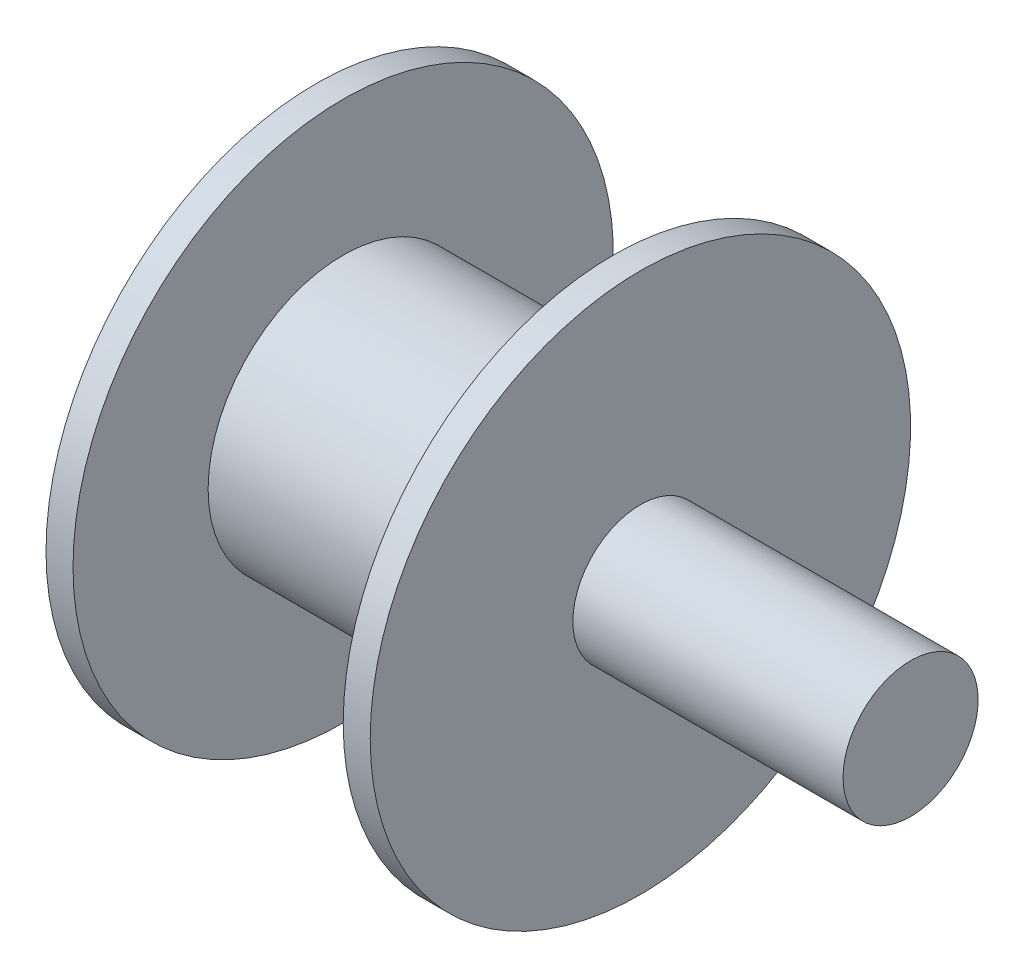
ISO-10303-21;
HEADER;
FILE_DESCRIPTION(('STEP AP214'),'2;1');
FILE_NAME('part.step','',(''),(''),'','','');
FILE_SCHEMA(('AUTOMOTIVE_DESIGN { 1 0 10303 214 1 1 1 1 }'));
ENDSEC;
DATA;
#1=APPLICATION_CONTEXT('core data for automotive mechanical design processes');
#2=APPLICATION_PROTOCOL_DEFINITION('international standard','automotive_design',2000,#1);
#3=PRODUCT_CONTEXT('',#1,'mechanical');
#4=PRODUCT('Part','Part','',(#3));
#5=PRODUCT_RELATED_PRODUCT_CATEGORY('part','',(#4));
#6=PRODUCT_DEFINITION_FORMATION('','',#4);
#7=PRODUCT_DEFINITION_CONTEXT('part definition',#1,'design');
#8=PRODUCT_DEFINITION('design','',#6,#7);
#9=PRODUCT_DEFINITION_SHAPE('','',#8);
#10=(LENGTH_UNIT() NAMED_UNIT(*) SI_UNIT(.MILLI.,.METRE.));
#11=(NAMED_UNIT(*) PLANE_ANGLE_UNIT() SI_UNIT($,.RADIAN.));
#12=(NAMED_UNIT(*) SI_UNIT($,.STERADIAN.) SOLID_ANGLE_UNIT());
#13=UNCERTAINTY_MEASURE_WITH_UNIT(LENGTH_MEASURE(1.E-05),#10,'distance_accuracy_value','');
#14=(GEOMETRIC_REPRESENTATION_CONTEXT(3) GLOBAL_UNCERTAINTY_ASSIGNED_CONTEXT((#13)) GLOBAL_UNIT_ASSIGNED_CONTEXT((#10,
#11,#12)) REPRESENTATION_CONTEXT('',''));
#15=CARTESIAN_POINT('',(0.,0.,0.));
#16=DIRECTION('',(0.,0.,1.));
#17=DIRECTION('',(1.,0.,0.));
#18=AXIS2_PLACEMENT_3D('',#15,#16,#17);
#19=CARTESIAN_POINT('',(-50.948509485101,0.,0.));
#20=DIRECTION('',(1.,0.,0.));
#21=DIRECTION('',(0.,0.,-1.));
#22=AXIS2_PLACEMENT_3D('',#19,#20,#21);
#23=PLANE('',#22);
#24=CARTESIAN_POINT('',(-50.948509485101,0.,0.));
#25=DIRECTION('',(-1.,0.,0.));
#26=DIRECTION('',(0.,0.,1.));
#27=AXIS2_PLACEMENT_3D('',#24,#25,#26);
#28=CIRCLE('',#27,20.);
#29=CARTESIAN_POINT('',(-50.948509485101,0.,20.));
#30=VERTEX_POINT('',#29);
#31=EDGE_CURVE('E10',#30,#30,#28,.T.);
#32=ORIENTED_EDGE('',*,*,#31,.T.);
#33=EDGE_LOOP('',(#32));
#34=FACE_BOUND('',#33,.T.);
#35=ADVANCED_FACE('F32',(#34),#23,.F.);
#36=CARTESIAN_POINT('',(-571.787663179475,0.,0.));
#37=DIRECTION('',(-1.,0.,0.));
#38=DIRECTION('',(0.,0.,1.));
#39=AXIS2_PLACEMENT_3D('',#36,#37,#38);
#40=CYLINDRICAL_SURFACE('',#39,20.);
#41=ORIENTED_EDGE('',*,*,#31,.F.);
#42=EDGE_LOOP('',(#41));
#43=FACE_BOUND('',#42,.T.);
#44=CARTESIAN_POINT('',(-48.948509485101,0.,0.));
#45=DIRECTION('',(-1.,0.,0.));
#46=DIRECTION('',(0.,0.,1.));
#47=AXIS2_PLACEMENT_3D('',#44,#45,#46);
#48=CIRCLE('',#47,20.);
#49=CARTESIAN_POINT('',(-48.948509485101,0.,20.));
#50=VERTEX_POINT('',#49);
#51=EDGE_CURVE('E38',#50,#50,#48,.T.);
#52=ORIENTED_EDGE('',*,*,#51,.T.);
#53=EDGE_LOOP('',(#52));
#54=FACE_BOUND('',#53,.T.);
#55=ADVANCED_FACE('F76',(#43,#54),#40,.T.);
#56=CARTESIAN_POINT('',(-48.948509485101,20.,0.));
#57=DIRECTION('',(-1.,0.,0.));
#58=DIRECTION('',(0.,0.,1.));
#59=AXIS2_PLACEMENT_3D('',#56,#57,#58);
#60=PLANE('',#59);
#61=ORIENTED_EDGE('',*,*,#51,.F.);
#62=EDGE_LOOP('',(#61));
#63=FACE_BOUND('',#62,.T.);
#64=CARTESIAN_POINT('',(-48.948509485101,0.,0.));
#65=DIRECTION('',(-1.,0.,0.));
#66=DIRECTION('',(0.,0.,1.));
#67=AXIS2_PLACEMENT_3D('',#64,#65,#66);
#68=CIRCLE('',#67,10.);
#69=CARTESIAN_POINT('',(-48.948509485101,0.,10.));
#70=VERTEX_POINT('',#69);
#71=EDGE_CURVE('E42',#70,#70,#68,.T.);
#72=ORIENTED_EDGE('',*,*,#71,.T.);
#73=EDGE_LOOP('',(#72));
#74=FACE_BOUND('',#73,.T.);
#75=ADVANCED_FACE('F80',(#63,#74),#60,.F.);
#76=CARTESIAN_POINT('',(-571.787663179475,0.,0.));
#77=DIRECTION('',(-1.,0.,0.));
#78=DIRECTION('',(0.,0.,1.));
#79=AXIS2_PLACEMENT_3D('',#76,#77,#78);
#80=CYLINDRICAL_SURFACE('',#79,10.);
#81=ORIENTED_EDGE('',*,*,#71,.F.);
#82=EDGE_LOOP('',(#81));
#83=FACE_BOUND('',#82,.T.);
#84=CARTESIAN_POINT('',(-28.948509485101,0.,0.));
#85=DIRECTION('',(-1.,0.,0.));
#86=DIRECTION('',(0.,0.,1.));
#87=AXIS2_PLACEMENT_3D('',#84,#85,#86);
#88=CIRCLE('',#87,10.);
#89=CARTESIAN_POINT('',(-28.948509485101,0.,10.));
#90=VERTEX_POINT('',#89);
#91=EDGE_CURVE('E46',#90,#90,#88,.T.);
#92=ORIENTED_EDGE('',*,*,#91,.T.);
#93=EDGE_LOOP('',(#92));
#94=FACE_BOUND('',#93,.T.);
#95=ADVANCED_FACE('F85',(#83,#94),#80,.T.);
#96=CARTESIAN_POINT('',(-28.948509485101,10.,0.));
#97=DIRECTION('',(1.,0.,0.));
#98=DIRECTION('',(0.,0.,-1.));
#99=AXIS2_PLACEMENT_3D('',#96,#97,#98);
#100=PLANE('',#99);
#101=ORIENTED_EDGE('',*,*,#91,.F.);
#102=EDGE_LOOP('',(#101));
#103=FACE_BOUND('',#102,.T.);
#104=CARTESIAN_POINT('',(-28.948509485101,0.,0.));
#105=DIRECTION('',(-1.,0.,0.));
#106=DIRECTION('',(0.,0.,1.));
#107=AXIS2_PLACEMENT_3D('',#104,#105,#106);
#108=CIRCLE('',#107,20.);
#109=CARTESIAN_POINT('',(-28.948509485101,0.,20.));
#110=VERTEX_POINT('',#109);
#111=EDGE_CURVE('E51',#110,#110,#108,.T.);
#112=ORIENTED_EDGE('',*,*,#111,.T.);
#113=EDGE_LOOP('',(#112));
#114=FACE_BOUND('',#113,.T.);
#115=ADVANCED_FACE('F91',(#103,#114),#100,.F.);
#116=CARTESIAN_POINT('',(-571.787663179475,0.,0.));
#117=DIRECTION('',(-1.,0.,0.));
#118=DIRECTION('',(0.,0.,1.));
#119=AXIS2_PLACEMENT_3D('',#116,#117,#118);
#120=CYLINDRICAL_SURFACE('',#119,20.);
#121=ORIENTED_EDGE('',*,*,#111,.F.);
#122=EDGE_LOOP('',(#121));
#123=FACE_BOUND('',#122,.T.);
#124=CARTESIAN_POINT('',(-26.948509485101,0.,0.));
#125=DIRECTION('',(-1.,0.,0.));
#126=DIRECTION('',(0.,0.,1.));
#127=AXIS2_PLACEMENT_3D('',#124,#125,#126);
#128=CIRCLE('',#127,20.);
#129=CARTESIAN_POINT('',(-26.948509485101,0.,20.));
#130=VERTEX_POINT('',#129);
#131=EDGE_CURVE('E54',#130,#130,#128,.T.);
#132=ORIENTED_EDGE('',*,*,#131,.T.);
#133=EDGE_LOOP('',(#132));
#134=FACE_BOUND('',#133,.T.);
#135=ADVANCED_FACE('F95',(#123,#134),#120,.T.);
#136=CARTESIAN_POINT('',(-26.948509485101,20.,0.));
#137=DIRECTION('',(-1.,0.,0.));
#138=DIRECTION('',(0.,0.,1.));
#139=AXIS2_PLACEMENT_3D('',#136,#137,#138);
#140=PLANE('',#139);
#141=ORIENTED_EDGE('',*,*,#131,.F.);
#142=EDGE_LOOP('',(#141));
#143=FACE_BOUND('',#142,.T.);
#144=CARTESIAN_POINT('',(-26.948509485101,0.,0.));
#145=DIRECTION('',(-1.,0.,0.));
#146=DIRECTION('',(0.,0.,1.));
#147=AXIS2_PLACEMENT_3D('',#144,#145,#146);
#148=CIRCLE('',#147,5.);
#149=CARTESIAN_POINT('',(-26.948509485101,0.,5.));
#150=VERTEX_POINT('',#149);
#151=EDGE_CURVE('E57',#150,#150,#148,.T.);
#152=ORIENTED_EDGE('',*,*,#151,.T.);
#153=EDGE_LOOP('',(#152));
#154=FACE_BOUND('',#153,.T.);
#155=ADVANCED_FACE('F72',(#143,#154),#140,.F.);
#156=CARTESIAN_POINT('',(-571.787663179475,0.,0.));
#157=DIRECTION('',(-1.,0.,0.));
#158=DIRECTION('',(0.,0.,1.));
#159=AXIS2_PLACEMENT_3D('',#156,#157,#158);
#160=CYLINDRICAL_SURFACE('',#159,5.);
#161=ORIENTED_EDGE('',*,*,#151,.F.);
#162=EDGE_LOOP('',(#161));
#163=FACE_BOUND('',#162,.T.);
#164=CARTESIAN_POINT('',(-6.94850948510095,0.,0.));
#165=DIRECTION('',(-1.,0.,0.));
#166=DIRECTION('',(0.,0.,1.));
#167=AXIS2_PLACEMENT_3D('',#164,#165,#166);
#168=CIRCLE('',#167,5.);
#169=CARTESIAN_POINT('',(-6.94850948510095,0.,5.));
#170=VERTEX_POINT('',#169);
#171=EDGE_CURVE('E60',#170,#170,#168,.T.);
#172=ORIENTED_EDGE('',*,*,#171,.T.);
#173=EDGE_LOOP('',(#172));
#174=FACE_BOUND('',#173,.T.);
#175=ADVANCED_FACE('F64',(#163,#174),#160,.T.);
#176=CARTESIAN_POINT('',(-6.94850948510096,5.,0.));
#177=DIRECTION('',(-1.,0.,0.));
#178=DIRECTION('',(0.,0.,1.));
#179=AXIS2_PLACEMENT_3D('',#176,#177,#178);
#180=PLANE('',#179);
#181=ORIENTED_EDGE('',*,*,#171,.F.);
#182=EDGE_LOOP('',(#181));
#183=FACE_BOUND('',#182,.T.);
#184=ADVANCED_FACE('F66',(#183),#180,.F.);
#185=CLOSED_SHELL('',(#35,#55,#75,#95,#115,#135,#155,#175,#184));
#186=MANIFOLD_SOLID_BREP('B2',#185);
#187=ADVANCED_BREP_SHAPE_REPRESENTATION('',(#18,#186),#14);
#188=SHAPE_DEFINITION_REPRESENTATION(#9,#187);
ENDSEC;
END-ISO-10303-21;
